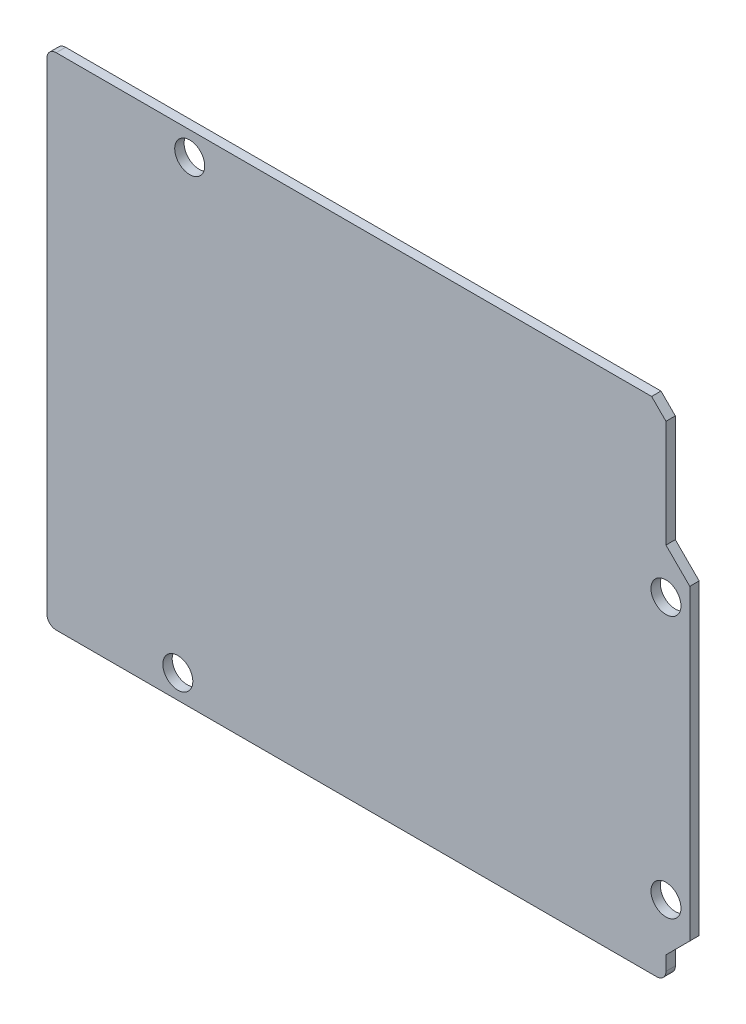
ISO-10303-21;
HEADER;
FILE_DESCRIPTION(('STEP AP214'),'2;1');
FILE_NAME('part.step','',(''),(''),'','','');
FILE_SCHEMA(('AUTOMOTIVE_DESIGN { 1 0 10303 214 1 1 1 1 }'));
ENDSEC;
DATA;
#1=APPLICATION_CONTEXT('core data for automotive mechanical design processes');
#2=APPLICATION_PROTOCOL_DEFINITION('international standard','automotive_design',2000,#1);
#3=PRODUCT_CONTEXT('',#1,'mechanical');
#4=PRODUCT('Part','Part','',(#3));
#5=PRODUCT_RELATED_PRODUCT_CATEGORY('part','',(#4));
#6=PRODUCT_DEFINITION_FORMATION('','',#4);
#7=PRODUCT_DEFINITION_CONTEXT('part definition',#1,'design');
#8=PRODUCT_DEFINITION('design','',#6,#7);
#9=PRODUCT_DEFINITION_SHAPE('','',#8);
#10=(LENGTH_UNIT() NAMED_UNIT(*) SI_UNIT(.MILLI.,.METRE.));
#11=(NAMED_UNIT(*) PLANE_ANGLE_UNIT() SI_UNIT($,.RADIAN.));
#12=(NAMED_UNIT(*) SI_UNIT($,.STERADIAN.) SOLID_ANGLE_UNIT());
#13=UNCERTAINTY_MEASURE_WITH_UNIT(LENGTH_MEASURE(1.E-05),#10,'distance_accuracy_value','');
#14=(GEOMETRIC_REPRESENTATION_CONTEXT(3) GLOBAL_UNCERTAINTY_ASSIGNED_CONTEXT((#13)) GLOBAL_UNIT_ASSIGNED_CONTEXT((#10,
#11,#12)) REPRESENTATION_CONTEXT('',''));
#15=CARTESIAN_POINT('',(0.,0.,0.));
#16=DIRECTION('',(0.,0.,1.));
#17=DIRECTION('',(1.,0.,0.));
#18=AXIS2_PLACEMENT_3D('',#15,#16,#17);
#19=CARTESIAN_POINT('',(34.452289780928,26.273241677338,-1.));
#20=DIRECTION('',(0.,0.,1.));
#21=DIRECTION('',(1.,0.,0.));
#22=AXIS2_PLACEMENT_3D('',#19,#20,#21);
#23=PLANE('',#22);
#24=CARTESIAN_POINT('',(66.04,7.62,-1.));
#25=DIRECTION('',(0.,0.,1.));
#26=DIRECTION('',(1.,0.,0.));
#27=AXIS2_PLACEMENT_3D('',#24,#25,#26);
#28=CIRCLE('',#27,1.6);
#29=CARTESIAN_POINT('',(67.64,7.62,-1.));
#30=VERTEX_POINT('',#29);
#31=EDGE_CURVE('E11',#30,#30,#28,.T.);
#32=ORIENTED_EDGE('',*,*,#31,.T.);
#33=EDGE_LOOP('',(#32));
#34=FACE_BOUND('',#33,.T.);
#35=CARTESIAN_POINT('',(66.04,35.56,-1.));
#36=DIRECTION('',(0.,0.,1.));
#37=DIRECTION('',(1.,0.,0.));
#38=AXIS2_PLACEMENT_3D('',#35,#36,#37);
#39=CIRCLE('',#38,1.6);
#40=CARTESIAN_POINT('',(67.64,35.56,-1.));
#41=VERTEX_POINT('',#40);
#42=EDGE_CURVE('E283',#41,#41,#39,.T.);
#43=ORIENTED_EDGE('',*,*,#42,.T.);
#44=EDGE_LOOP('',(#43));
#45=FACE_BOUND('',#44,.T.);
#46=CARTESIAN_POINT('',(13.97,2.54,-1.));
#47=DIRECTION('',(0.,0.,1.));
#48=DIRECTION('',(1.,0.,0.));
#49=AXIS2_PLACEMENT_3D('',#46,#47,#48);
#50=CIRCLE('',#49,1.6);
#51=CARTESIAN_POINT('',(15.57,2.54,-1.));
#52=VERTEX_POINT('',#51);
#53=EDGE_CURVE('E272',#52,#52,#50,.T.);
#54=ORIENTED_EDGE('',*,*,#53,.T.);
#55=EDGE_LOOP('',(#54));
#56=FACE_BOUND('',#55,.T.);
#57=CARTESIAN_POINT('',(15.24,50.794834361186,-1.));
#58=DIRECTION('',(0.,0.,1.));
#59=DIRECTION('',(1.,0.,0.));
#60=AXIS2_PLACEMENT_3D('',#57,#58,#59);
#61=CIRCLE('',#60,1.6);
#62=CARTESIAN_POINT('',(16.84,50.794834361186,-1.));
#63=VERTEX_POINT('',#62);
#64=EDGE_CURVE('E264',#63,#63,#61,.T.);
#65=ORIENTED_EDGE('',*,*,#64,.T.);
#66=EDGE_LOOP('',(#65));
#67=FACE_BOUND('',#66,.T.);
#68=DIRECTION('',(0.,1.,0.));
#69=VECTOR('',#68,1.);
#70=CARTESIAN_POINT('',(0.,1.,-1.));
#71=LINE('',#70,#69);
#72=CARTESIAN_POINT('',(0.,1.,-1.));
#73=VERTEX_POINT('',#72);
#74=CARTESIAN_POINT('',(0.,52.34,-1.));
#75=VERTEX_POINT('',#74);
#76=EDGE_CURVE('E332',#73,#75,#71,.T.);
#77=ORIENTED_EDGE('',*,*,#76,.T.);
#78=CARTESIAN_POINT('',(1.,52.34,-1.));
#79=DIRECTION('',(0.,0.,1.));
#80=DIRECTION('',(1.,0.,0.));
#81=AXIS2_PLACEMENT_3D('',#78,#79,#80);
#82=CIRCLE('',#81,1.);
#83=CARTESIAN_POINT('',(1.,53.34,-1.));
#84=VERTEX_POINT('',#83);
#85=EDGE_CURVE('E343',#84,#75,#82,.T.);
#86=ORIENTED_EDGE('',*,*,#85,.F.);
#87=DIRECTION('',(1.,0.,0.));
#88=VECTOR('',#87,1.);
#89=CARTESIAN_POINT('',(1.,53.34,-1.));
#90=LINE('',#89,#88);
#91=CARTESIAN_POINT('',(64.509039941467,53.34,-1.));
#92=VERTEX_POINT('',#91);
#93=EDGE_CURVE('E357',#84,#92,#90,.T.);
#94=ORIENTED_EDGE('',*,*,#93,.T.);
#95=DIRECTION('',(-0.707106781186548,0.707106781186548,0.));
#96=VECTOR('',#95,1.);
#97=CARTESIAN_POINT('',(66.04,51.809039941467,-1.));
#98=LINE('',#97,#96);
#99=CARTESIAN_POINT('',(66.04,51.809039941467,-1.));
#100=VERTEX_POINT('',#99);
#101=EDGE_CURVE('E183',#100,#92,#98,.T.);
#102=ORIENTED_EDGE('',*,*,#101,.F.);
#103=DIRECTION('',(0.,1.,0.));
#104=VECTOR('',#103,1.);
#105=CARTESIAN_POINT('',(66.04,40.374776622894,-1.));
#106=LINE('',#105,#104);
#107=CARTESIAN_POINT('',(66.04,40.374776622894,-1.));
#108=VERTEX_POINT('',#107);
#109=EDGE_CURVE('E179',#108,#100,#106,.T.);
#110=ORIENTED_EDGE('',*,*,#109,.F.);
#111=DIRECTION('',(-0.707106781186548,0.707106781186548,0.));
#112=VECTOR('',#111,1.);
#113=CARTESIAN_POINT('',(68.58,37.834776622894,-1.));
#114=LINE('',#113,#112);
#115=CARTESIAN_POINT('',(68.58,37.834776622894,-1.));
#116=VERTEX_POINT('',#115);
#117=EDGE_CURVE('E167',#116,#108,#114,.T.);
#118=ORIENTED_EDGE('',*,*,#117,.F.);
#119=DIRECTION('',(0.,1.,0.));
#120=VECTOR('',#119,1.);
#121=CARTESIAN_POINT('',(68.58,5.066803,-1.));
#122=LINE('',#121,#120);
#123=CARTESIAN_POINT('',(68.58,5.066803,-1.));
#124=VERTEX_POINT('',#123);
#125=EDGE_CURVE('E209',#124,#116,#122,.T.);
#126=ORIENTED_EDGE('',*,*,#125,.F.);
#127=DIRECTION('',(0.706753455353018,0.707459930559018,0.));
#128=VECTOR('',#127,1.);
#129=CARTESIAN_POINT('',(66.04,2.524264,-1.));
#130=LINE('',#129,#128);
#131=CARTESIAN_POINT('',(66.04,2.524264,-1.));
#132=VERTEX_POINT('',#131);
#133=EDGE_CURVE('E219',#132,#124,#130,.T.);
#134=ORIENTED_EDGE('',*,*,#133,.F.);
#135=DIRECTION('',(0.,1.,0.));
#136=VECTOR('',#135,1.);
#137=CARTESIAN_POINT('',(66.04,1.,-1.));
#138=LINE('',#137,#136);
#139=CARTESIAN_POINT('',(66.04,1.,-1.));
#140=VERTEX_POINT('',#139);
#141=EDGE_CURVE('E230',#140,#132,#138,.T.);
#142=ORIENTED_EDGE('',*,*,#141,.F.);
#143=CARTESIAN_POINT('',(65.04,1.,-1.));
#144=DIRECTION('',(0.,0.,1.));
#145=DIRECTION('',(1.,0.,0.));
#146=AXIS2_PLACEMENT_3D('',#143,#144,#145);
#147=CIRCLE('',#146,1.);
#148=CARTESIAN_POINT('',(65.04,0.,-1.));
#149=VERTEX_POINT('',#148);
#150=EDGE_CURVE('E239',#149,#140,#147,.T.);
#151=ORIENTED_EDGE('',*,*,#150,.F.);
#152=DIRECTION('',(1.,0.,0.));
#153=VECTOR('',#152,1.);
#154=CARTESIAN_POINT('',(1.,0.,-1.));
#155=LINE('',#154,#153);
#156=CARTESIAN_POINT('',(1.,0.,-1.));
#157=VERTEX_POINT('',#156);
#158=EDGE_CURVE('E249',#157,#149,#155,.T.);
#159=ORIENTED_EDGE('',*,*,#158,.F.);
#160=CARTESIAN_POINT('',(1.,1.,-1.));
#161=DIRECTION('',(0.,0.,1.));
#162=DIRECTION('',(1.,0.,0.));
#163=AXIS2_PLACEMENT_3D('',#160,#161,#162);
#164=CIRCLE('',#163,1.);
#165=EDGE_CURVE('E255',#73,#157,#164,.T.);
#166=ORIENTED_EDGE('',*,*,#165,.F.);
#167=EDGE_LOOP('',(#77,#86,#94,#102,#110,#118,#126,#134,#142,#151,#159,#166));
#168=FACE_BOUND('',#167,.T.);
#169=ADVANCED_FACE('F17',(#34,#45,#56,#67,#168),#23,.F.);
#170=CARTESIAN_POINT('',(34.452289780928,26.273241677338,0.));
#171=DIRECTION('',(0.,0.,1.));
#172=DIRECTION('',(1.,0.,0.));
#173=AXIS2_PLACEMENT_3D('',#170,#171,#172);
#174=PLANE('',#173);
#175=CARTESIAN_POINT('',(66.04,7.62,0.));
#176=DIRECTION('',(0.,0.,1.));
#177=DIRECTION('',(1.,0.,0.));
#178=AXIS2_PLACEMENT_3D('',#175,#176,#177);
#179=CIRCLE('',#178,1.6);
#180=CARTESIAN_POINT('',(67.64,7.62,0.));
#181=VERTEX_POINT('',#180);
#182=EDGE_CURVE('E286',#181,#181,#179,.T.);
#183=ORIENTED_EDGE('',*,*,#182,.F.);
#184=EDGE_LOOP('',(#183));
#185=FACE_BOUND('',#184,.T.);
#186=CARTESIAN_POINT('',(66.04,35.56,0.));
#187=DIRECTION('',(0.,0.,1.));
#188=DIRECTION('',(1.,0.,0.));
#189=AXIS2_PLACEMENT_3D('',#186,#187,#188);
#190=CIRCLE('',#189,1.6);
#191=CARTESIAN_POINT('',(67.64,35.56,0.));
#192=VERTEX_POINT('',#191);
#193=EDGE_CURVE('E277',#192,#192,#190,.T.);
#194=ORIENTED_EDGE('',*,*,#193,.F.);
#195=EDGE_LOOP('',(#194));
#196=FACE_BOUND('',#195,.T.);
#197=CARTESIAN_POINT('',(13.97,2.54,0.));
#198=DIRECTION('',(0.,0.,1.));
#199=DIRECTION('',(1.,0.,0.));
#200=AXIS2_PLACEMENT_3D('',#197,#198,#199);
#201=CIRCLE('',#200,1.6);
#202=CARTESIAN_POINT('',(15.57,2.54,0.));
#203=VERTEX_POINT('',#202);
#204=EDGE_CURVE('E268',#203,#203,#201,.T.);
#205=ORIENTED_EDGE('',*,*,#204,.F.);
#206=EDGE_LOOP('',(#205));
#207=FACE_BOUND('',#206,.T.);
#208=CARTESIAN_POINT('',(15.24,50.794834361186,0.));
#209=DIRECTION('',(0.,0.,1.));
#210=DIRECTION('',(1.,0.,0.));
#211=AXIS2_PLACEMENT_3D('',#208,#209,#210);
#212=CIRCLE('',#211,1.6);
#213=CARTESIAN_POINT('',(16.84,50.794834361186,0.));
#214=VERTEX_POINT('',#213);
#215=EDGE_CURVE('E257',#214,#214,#212,.T.);
#216=ORIENTED_EDGE('',*,*,#215,.F.);
#217=EDGE_LOOP('',(#216));
#218=FACE_BOUND('',#217,.T.);
#219=CARTESIAN_POINT('',(1.,1.,0.));
#220=DIRECTION('',(0.,0.,1.));
#221=DIRECTION('',(1.,0.,0.));
#222=AXIS2_PLACEMENT_3D('',#219,#220,#221);
#223=CIRCLE('',#222,1.);
#224=CARTESIAN_POINT('',(0.,1.,0.));
#225=VERTEX_POINT('',#224);
#226=CARTESIAN_POINT('',(1.,0.,0.));
#227=VERTEX_POINT('',#226);
#228=EDGE_CURVE('E260',#225,#227,#223,.T.);
#229=ORIENTED_EDGE('',*,*,#228,.T.);
#230=DIRECTION('',(1.,0.,0.));
#231=VECTOR('',#230,1.);
#232=CARTESIAN_POINT('',(1.,0.,0.));
#233=LINE('',#232,#231);
#234=CARTESIAN_POINT('',(65.04,0.,0.));
#235=VERTEX_POINT('',#234);
#236=EDGE_CURVE('E251',#227,#235,#233,.T.);
#237=ORIENTED_EDGE('',*,*,#236,.T.);
#238=CARTESIAN_POINT('',(65.04,1.,0.));
#239=DIRECTION('',(0.,0.,1.));
#240=DIRECTION('',(1.,0.,0.));
#241=AXIS2_PLACEMENT_3D('',#238,#239,#240);
#242=CIRCLE('',#241,1.);
#243=CARTESIAN_POINT('',(66.04,1.,0.));
#244=VERTEX_POINT('',#243);
#245=EDGE_CURVE('E242',#235,#244,#242,.T.);
#246=ORIENTED_EDGE('',*,*,#245,.T.);
#247=DIRECTION('',(0.,1.,0.));
#248=VECTOR('',#247,1.);
#249=CARTESIAN_POINT('',(66.04,1.,0.));
#250=LINE('',#249,#248);
#251=CARTESIAN_POINT('',(66.04,2.524264,0.));
#252=VERTEX_POINT('',#251);
#253=EDGE_CURVE('E233',#244,#252,#250,.T.);
#254=ORIENTED_EDGE('',*,*,#253,.T.);
#255=DIRECTION('',(0.706753455353018,0.707459930559018,0.));
#256=VECTOR('',#255,1.);
#257=CARTESIAN_POINT('',(66.04,2.524264,0.));
#258=LINE('',#257,#256);
#259=CARTESIAN_POINT('',(68.58,5.066803,0.));
#260=VERTEX_POINT('',#259);
#261=EDGE_CURVE('E224',#252,#260,#258,.T.);
#262=ORIENTED_EDGE('',*,*,#261,.T.);
#263=DIRECTION('',(0.,1.,0.));
#264=VECTOR('',#263,1.);
#265=CARTESIAN_POINT('',(68.58,5.066803,0.));
#266=LINE('',#265,#264);
#267=CARTESIAN_POINT('',(68.58,37.834776622894,0.));
#268=VERTEX_POINT('',#267);
#269=EDGE_CURVE('E213',#260,#268,#266,.T.);
#270=ORIENTED_EDGE('',*,*,#269,.T.);
#271=DIRECTION('',(-0.707106781186548,0.707106781186548,0.));
#272=VECTOR('',#271,1.);
#273=CARTESIAN_POINT('',(68.58,37.834776622894,0.));
#274=LINE('',#273,#272);
#275=CARTESIAN_POINT('',(66.04,40.374776622894,0.));
#276=VERTEX_POINT('',#275);
#277=EDGE_CURVE('E180',#268,#276,#274,.T.);
#278=ORIENTED_EDGE('',*,*,#277,.T.);
#279=DIRECTION('',(0.,1.,0.));
#280=VECTOR('',#279,1.);
#281=CARTESIAN_POINT('',(66.04,40.374776622894,0.));
#282=LINE('',#281,#280);
#283=CARTESIAN_POINT('',(66.04,51.809039941467,0.));
#284=VERTEX_POINT('',#283);
#285=EDGE_CURVE('E187',#276,#284,#282,.T.);
#286=ORIENTED_EDGE('',*,*,#285,.T.);
#287=DIRECTION('',(-0.707106781186548,0.707106781186548,0.));
#288=VECTOR('',#287,1.);
#289=CARTESIAN_POINT('',(66.04,51.809039941467,0.));
#290=LINE('',#289,#288);
#291=CARTESIAN_POINT('',(64.509039941467,53.34,0.));
#292=VERTEX_POINT('',#291);
#293=EDGE_CURVE('E193',#284,#292,#290,.T.);
#294=ORIENTED_EDGE('',*,*,#293,.T.);
#295=DIRECTION('',(1.,0.,0.));
#296=VECTOR('',#295,1.);
#297=CARTESIAN_POINT('',(1.,53.34,0.));
#298=LINE('',#297,#296);
#299=CARTESIAN_POINT('',(1.,53.34,0.));
#300=VERTEX_POINT('',#299);
#301=EDGE_CURVE('E351',#300,#292,#298,.T.);
#302=ORIENTED_EDGE('',*,*,#301,.F.);
#303=CARTESIAN_POINT('',(1.,52.34,0.));
#304=DIRECTION('',(0.,0.,1.));
#305=DIRECTION('',(1.,0.,0.));
#306=AXIS2_PLACEMENT_3D('',#303,#304,#305);
#307=CIRCLE('',#306,1.);
#308=CARTESIAN_POINT('',(0.,52.34,0.));
#309=VERTEX_POINT('',#308);
#310=EDGE_CURVE('E346',#300,#309,#307,.T.);
#311=ORIENTED_EDGE('',*,*,#310,.T.);
#312=DIRECTION('',(0.,1.,0.));
#313=VECTOR('',#312,1.);
#314=CARTESIAN_POINT('',(0.,1.,0.));
#315=LINE('',#314,#313);
#316=EDGE_CURVE('E409',#225,#309,#315,.T.);
#317=ORIENTED_EDGE('',*,*,#316,.F.);
#318=EDGE_LOOP('',(#229,#237,#246,#254,#262,#270,#278,#286,#294,#302,#311,#317));
#319=FACE_BOUND('',#318,.T.);
#320=ADVANCED_FACE('F296',(#185,#196,#207,#218,#319),#174,.T.);
#321=CARTESIAN_POINT('',(66.04,7.62,0.));
#322=DIRECTION('',(0.,0.,1.));
#323=DIRECTION('',(1.,0.,0.));
#324=AXIS2_PLACEMENT_3D('',#321,#322,#323);
#325=CYLINDRICAL_SURFACE('',#324,1.6);
#326=ORIENTED_EDGE('',*,*,#182,.T.);
#327=DIRECTION('',(0.,0.,-1.));
#328=VECTOR('',#327,1.);
#329=CARTESIAN_POINT('',(67.64,7.62,0.));
#330=LINE('',#329,#328);
#331=EDGE_CURVE('E20',#181,#30,#330,.T.);
#332=ORIENTED_EDGE('',*,*,#331,.T.);
#333=ORIENTED_EDGE('',*,*,#31,.F.);
#334=ORIENTED_EDGE('',*,*,#331,.F.);
#335=EDGE_LOOP('',(#326,#332,#333,#334));
#336=FACE_BOUND('',#335,.T.);
#337=ADVANCED_FACE('F293',(#336),#325,.F.);
#338=CARTESIAN_POINT('',(66.04,35.56,0.));
#339=DIRECTION('',(0.,0.,1.));
#340=DIRECTION('',(1.,0.,0.));
#341=AXIS2_PLACEMENT_3D('',#338,#339,#340);
#342=CYLINDRICAL_SURFACE('',#341,1.6);
#343=ORIENTED_EDGE('',*,*,#193,.T.);
#344=DIRECTION('',(0.,0.,-1.));
#345=VECTOR('',#344,1.);
#346=CARTESIAN_POINT('',(67.64,35.56,0.));
#347=LINE('',#346,#345);
#348=EDGE_CURVE('E278',#192,#41,#347,.T.);
#349=ORIENTED_EDGE('',*,*,#348,.T.);
#350=ORIENTED_EDGE('',*,*,#42,.F.);
#351=ORIENTED_EDGE('',*,*,#348,.F.);
#352=EDGE_LOOP('',(#343,#349,#350,#351));
#353=FACE_BOUND('',#352,.T.);
#354=ADVANCED_FACE('F294',(#353),#342,.F.);
#355=CARTESIAN_POINT('',(13.97,2.54,0.));
#356=DIRECTION('',(0.,0.,1.));
#357=DIRECTION('',(1.,0.,0.));
#358=AXIS2_PLACEMENT_3D('',#355,#356,#357);
#359=CYLINDRICAL_SURFACE('',#358,1.6);
#360=ORIENTED_EDGE('',*,*,#204,.T.);
#361=DIRECTION('',(0.,0.,-1.));
#362=VECTOR('',#361,1.);
#363=CARTESIAN_POINT('',(15.57,2.54,0.));
#364=LINE('',#363,#362);
#365=EDGE_CURVE('E267',#203,#52,#364,.T.);
#366=ORIENTED_EDGE('',*,*,#365,.T.);
#367=ORIENTED_EDGE('',*,*,#53,.F.);
#368=ORIENTED_EDGE('',*,*,#365,.F.);
#369=EDGE_LOOP('',(#360,#366,#367,#368));
#370=FACE_BOUND('',#369,.T.);
#371=ADVANCED_FACE('F302',(#370),#359,.F.);
#372=CARTESIAN_POINT('',(15.24,50.794834361186,0.));
#373=DIRECTION('',(0.,0.,1.));
#374=DIRECTION('',(1.,0.,0.));
#375=AXIS2_PLACEMENT_3D('',#372,#373,#374);
#376=CYLINDRICAL_SURFACE('',#375,1.6);
#377=ORIENTED_EDGE('',*,*,#215,.T.);
#378=DIRECTION('',(0.,0.,-1.));
#379=VECTOR('',#378,1.);
#380=CARTESIAN_POINT('',(16.84,50.794834361186,0.));
#381=LINE('',#380,#379);
#382=EDGE_CURVE('E261',#214,#63,#381,.T.);
#383=ORIENTED_EDGE('',*,*,#382,.T.);
#384=ORIENTED_EDGE('',*,*,#64,.F.);
#385=ORIENTED_EDGE('',*,*,#382,.F.);
#386=EDGE_LOOP('',(#377,#383,#384,#385));
#387=FACE_BOUND('',#386,.T.);
#388=ADVANCED_FACE('F321',(#387),#376,.F.);
#389=CARTESIAN_POINT('',(1.,1.,0.));
#390=DIRECTION('',(0.,0.,1.));
#391=DIRECTION('',(1.,0.,0.));
#392=AXIS2_PLACEMENT_3D('',#389,#390,#391);
#393=CYLINDRICAL_SURFACE('',#392,1.);
#394=DIRECTION('',(0.,0.,-1.));
#395=VECTOR('',#394,1.);
#396=CARTESIAN_POINT('',(0.,1.,0.));
#397=LINE('',#396,#395);
#398=EDGE_CURVE('E334',#225,#73,#397,.T.);
#399=ORIENTED_EDGE('',*,*,#398,.T.);
#400=ORIENTED_EDGE('',*,*,#165,.T.);
#401=DIRECTION('',(0.,0.,-1.));
#402=VECTOR('',#401,1.);
#403=CARTESIAN_POINT('',(1.,0.,0.));
#404=LINE('',#403,#402);
#405=EDGE_CURVE('E246',#227,#157,#404,.T.);
#406=ORIENTED_EDGE('',*,*,#405,.F.);
#407=ORIENTED_EDGE('',*,*,#228,.F.);
#408=EDGE_LOOP('',(#399,#400,#406,#407));
#409=FACE_BOUND('',#408,.T.);
#410=ADVANCED_FACE('F400',(#409),#393,.T.);
#411=CARTESIAN_POINT('',(1.,0.,0.));
#412=DIRECTION('',(0.,-1.,0.));
#413=DIRECTION('',(0.,0.,-1.));
#414=AXIS2_PLACEMENT_3D('',#411,#412,#413);
#415=PLANE('',#414);
#416=ORIENTED_EDGE('',*,*,#405,.T.);
#417=ORIENTED_EDGE('',*,*,#158,.T.);
#418=DIRECTION('',(0.,0.,-1.));
#419=VECTOR('',#418,1.);
#420=CARTESIAN_POINT('',(65.04,0.,0.));
#421=LINE('',#420,#419);
#422=EDGE_CURVE('E240',#235,#149,#421,.T.);
#423=ORIENTED_EDGE('',*,*,#422,.F.);
#424=ORIENTED_EDGE('',*,*,#236,.F.);
#425=EDGE_LOOP('',(#416,#417,#423,#424));
#426=FACE_BOUND('',#425,.T.);
#427=ADVANCED_FACE('F395',(#426),#415,.T.);
#428=CARTESIAN_POINT('',(65.04,1.,0.));
#429=DIRECTION('',(0.,0.,1.));
#430=DIRECTION('',(1.,0.,0.));
#431=AXIS2_PLACEMENT_3D('',#428,#429,#430);
#432=CYLINDRICAL_SURFACE('',#431,1.);
#433=ORIENTED_EDGE('',*,*,#422,.T.);
#434=ORIENTED_EDGE('',*,*,#150,.T.);
#435=DIRECTION('',(0.,0.,-1.));
#436=VECTOR('',#435,1.);
#437=CARTESIAN_POINT('',(66.04,1.,0.));
#438=LINE('',#437,#436);
#439=EDGE_CURVE('E226',#244,#140,#438,.T.);
#440=ORIENTED_EDGE('',*,*,#439,.F.);
#441=ORIENTED_EDGE('',*,*,#245,.F.);
#442=EDGE_LOOP('',(#433,#434,#440,#441));
#443=FACE_BOUND('',#442,.T.);
#444=ADVANCED_FACE('F386',(#443),#432,.T.);
#445=CARTESIAN_POINT('',(66.04,1.,0.));
#446=DIRECTION('',(1.,0.,0.));
#447=DIRECTION('',(0.,1.,0.));
#448=AXIS2_PLACEMENT_3D('',#445,#446,#447);
#449=PLANE('',#448);
#450=ORIENTED_EDGE('',*,*,#439,.T.);
#451=ORIENTED_EDGE('',*,*,#141,.T.);
#452=DIRECTION('',(0.,0.,-1.));
#453=VECTOR('',#452,1.);
#454=CARTESIAN_POINT('',(66.04,2.524264,0.));
#455=LINE('',#454,#453);
#456=EDGE_CURVE('E216',#252,#132,#455,.T.);
#457=ORIENTED_EDGE('',*,*,#456,.F.);
#458=ORIENTED_EDGE('',*,*,#253,.F.);
#459=EDGE_LOOP('',(#450,#451,#457,#458));
#460=FACE_BOUND('',#459,.T.);
#461=ADVANCED_FACE('F384',(#460),#449,.T.);
#462=CARTESIAN_POINT('',(66.04,2.524264,0.));
#463=DIRECTION('',(0.707459930559018,-0.706753455353018,0.));
#464=DIRECTION('',(0.,0.,-1.));
#465=AXIS2_PLACEMENT_3D('',#462,#463,#464);
#466=PLANE('',#465);
#467=ORIENTED_EDGE('',*,*,#456,.T.);
#468=ORIENTED_EDGE('',*,*,#133,.T.);
#469=DIRECTION('',(0.,0.,-1.));
#470=VECTOR('',#469,1.);
#471=CARTESIAN_POINT('',(68.58,5.066803,0.));
#472=LINE('',#471,#470);
#473=EDGE_CURVE('E206',#260,#124,#472,.T.);
#474=ORIENTED_EDGE('',*,*,#473,.F.);
#475=ORIENTED_EDGE('',*,*,#261,.F.);
#476=EDGE_LOOP('',(#467,#468,#474,#475));
#477=FACE_BOUND('',#476,.T.);
#478=ADVANCED_FACE('F385',(#477),#466,.T.);
#479=CARTESIAN_POINT('',(68.58,5.066803,0.));
#480=DIRECTION('',(1.,0.,0.));
#481=DIRECTION('',(0.,1.,0.));
#482=AXIS2_PLACEMENT_3D('',#479,#480,#481);
#483=PLANE('',#482);
#484=ORIENTED_EDGE('',*,*,#473,.T.);
#485=ORIENTED_EDGE('',*,*,#125,.T.);
#486=DIRECTION('',(0.,0.,-1.));
#487=VECTOR('',#486,1.);
#488=CARTESIAN_POINT('',(68.58,37.834776622894,0.));
#489=LINE('',#488,#487);
#490=EDGE_CURVE('E174',#268,#116,#489,.T.);
#491=ORIENTED_EDGE('',*,*,#490,.F.);
#492=ORIENTED_EDGE('',*,*,#269,.F.);
#493=EDGE_LOOP('',(#484,#485,#491,#492));
#494=FACE_BOUND('',#493,.T.);
#495=ADVANCED_FACE('F372',(#494),#483,.T.);
#496=CARTESIAN_POINT('',(68.58,37.834776622894,0.));
#497=DIRECTION('',(0.707106781186548,0.707106781186548,0.));
#498=DIRECTION('',(0.,0.,-1.));
#499=AXIS2_PLACEMENT_3D('',#496,#497,#498);
#500=PLANE('',#499);
#501=ORIENTED_EDGE('',*,*,#490,.T.);
#502=ORIENTED_EDGE('',*,*,#117,.T.);
#503=DIRECTION('',(0.,0.,-1.));
#504=VECTOR('',#503,1.);
#505=CARTESIAN_POINT('',(66.04,40.374776622894,0.));
#506=LINE('',#505,#504);
#507=EDGE_CURVE('E171',#276,#108,#506,.T.);
#508=ORIENTED_EDGE('',*,*,#507,.F.);
#509=ORIENTED_EDGE('',*,*,#277,.F.);
#510=EDGE_LOOP('',(#501,#502,#508,#509));
#511=FACE_BOUND('',#510,.T.);
#512=ADVANCED_FACE('F169',(#511),#500,.T.);
#513=CARTESIAN_POINT('',(66.04,40.374776622894,0.));
#514=DIRECTION('',(1.,0.,0.));
#515=DIRECTION('',(0.,1.,0.));
#516=AXIS2_PLACEMENT_3D('',#513,#514,#515);
#517=PLANE('',#516);
#518=ORIENTED_EDGE('',*,*,#507,.T.);
#519=ORIENTED_EDGE('',*,*,#109,.T.);
#520=DIRECTION('',(0.,0.,-1.));
#521=VECTOR('',#520,1.);
#522=CARTESIAN_POINT('',(66.04,51.809039941467,0.));
#523=LINE('',#522,#521);
#524=EDGE_CURVE('E362',#284,#100,#523,.T.);
#525=ORIENTED_EDGE('',*,*,#524,.F.);
#526=ORIENTED_EDGE('',*,*,#285,.F.);
#527=EDGE_LOOP('',(#518,#519,#525,#526));
#528=FACE_BOUND('',#527,.T.);
#529=ADVANCED_FACE('F191',(#528),#517,.T.);
#530=CARTESIAN_POINT('',(66.04,51.809039941467,0.));
#531=DIRECTION('',(0.707106781186548,0.707106781186548,0.));
#532=DIRECTION('',(0.,0.,-1.));
#533=AXIS2_PLACEMENT_3D('',#530,#531,#532);
#534=PLANE('',#533);
#535=ORIENTED_EDGE('',*,*,#524,.T.);
#536=ORIENTED_EDGE('',*,*,#101,.T.);
#537=DIRECTION('',(0.,0.,-1.));
#538=VECTOR('',#537,1.);
#539=CARTESIAN_POINT('',(64.509039941467,53.34,0.));
#540=LINE('',#539,#538);
#541=EDGE_CURVE('E354',#292,#92,#540,.T.);
#542=ORIENTED_EDGE('',*,*,#541,.F.);
#543=ORIENTED_EDGE('',*,*,#293,.F.);
#544=EDGE_LOOP('',(#535,#536,#542,#543));
#545=FACE_BOUND('',#544,.T.);
#546=ADVANCED_FACE('F366',(#545),#534,.T.);
#547=CARTESIAN_POINT('',(1.,53.34,0.));
#548=DIRECTION('',(0.,-1.,0.));
#549=DIRECTION('',(0.,0.,-1.));
#550=AXIS2_PLACEMENT_3D('',#547,#548,#549);
#551=PLANE('',#550);
#552=ORIENTED_EDGE('',*,*,#301,.T.);
#553=ORIENTED_EDGE('',*,*,#541,.T.);
#554=ORIENTED_EDGE('',*,*,#93,.F.);
#555=DIRECTION('',(0.,0.,-1.));
#556=VECTOR('',#555,1.);
#557=CARTESIAN_POINT('',(1.,53.34,0.));
#558=LINE('',#557,#556);
#559=EDGE_CURVE('E336',#300,#84,#558,.T.);
#560=ORIENTED_EDGE('',*,*,#559,.F.);
#561=EDGE_LOOP('',(#552,#553,#554,#560));
#562=FACE_BOUND('',#561,.T.);
#563=ADVANCED_FACE('F420',(#562),#551,.F.);
#564=CARTESIAN_POINT('',(1.,52.34,0.));
#565=DIRECTION('',(0.,0.,1.));
#566=DIRECTION('',(1.,0.,0.));
#567=AXIS2_PLACEMENT_3D('',#564,#565,#566);
#568=CYLINDRICAL_SURFACE('',#567,1.);
#569=ORIENTED_EDGE('',*,*,#559,.T.);
#570=ORIENTED_EDGE('',*,*,#85,.T.);
#571=DIRECTION('',(0.,0.,-1.));
#572=VECTOR('',#571,1.);
#573=CARTESIAN_POINT('',(0.,52.34,0.));
#574=LINE('',#573,#572);
#575=EDGE_CURVE('E406',#309,#75,#574,.T.);
#576=ORIENTED_EDGE('',*,*,#575,.F.);
#577=ORIENTED_EDGE('',*,*,#310,.F.);
#578=EDGE_LOOP('',(#569,#570,#576,#577));
#579=FACE_BOUND('',#578,.T.);
#580=ADVANCED_FACE('F417',(#579),#568,.T.);
#581=CARTESIAN_POINT('',(0.,1.,0.));
#582=DIRECTION('',(1.,0.,0.));
#583=DIRECTION('',(0.,1.,0.));
#584=AXIS2_PLACEMENT_3D('',#581,#582,#583);
#585=PLANE('',#584);
#586=ORIENTED_EDGE('',*,*,#316,.T.);
#587=ORIENTED_EDGE('',*,*,#575,.T.);
#588=ORIENTED_EDGE('',*,*,#76,.F.);
#589=ORIENTED_EDGE('',*,*,#398,.F.);
#590=EDGE_LOOP('',(#586,#587,#588,#589));
#591=FACE_BOUND('',#590,.T.);
#592=ADVANCED_FACE('F402',(#591),#585,.F.);
#593=CLOSED_SHELL('',(#169,#320,#337,#354,#371,#388,#410,#427,#444,#461,#478,#495,#512,#529,
#546,#563,#580,#592));
#594=MANIFOLD_SOLID_BREP('B1',#593);
#595=ADVANCED_BREP_SHAPE_REPRESENTATION('',(#18,#594),#14);
#596=SHAPE_DEFINITION_REPRESENTATION(#9,#595);
ENDSEC;
END-ISO-10303-21;
